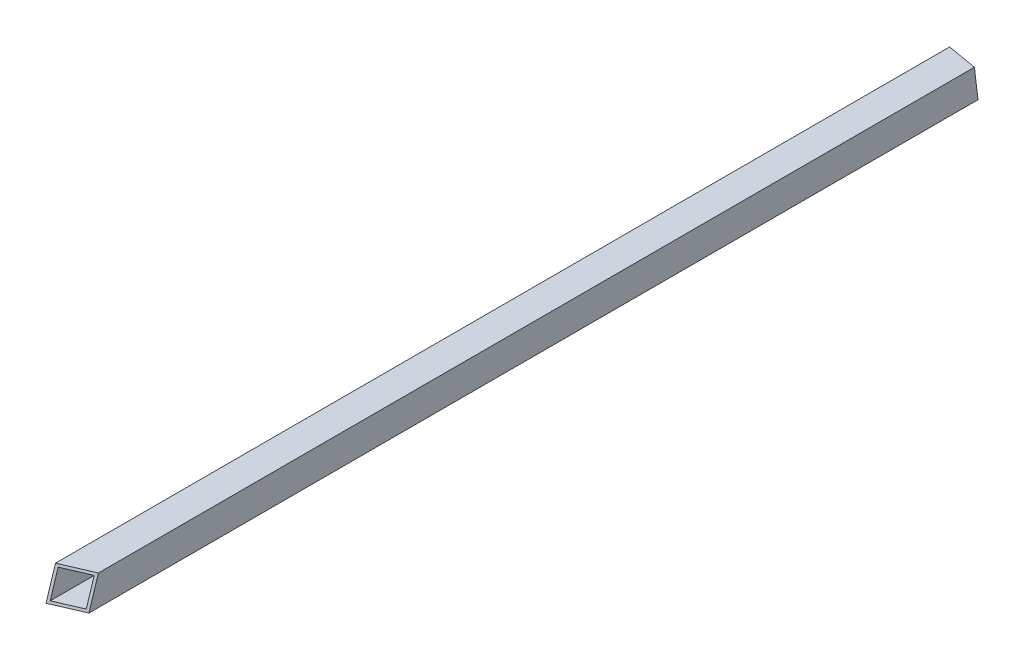
ISO-10303-21;
HEADER;
FILE_DESCRIPTION(('STEP AP214'),'2;1');
FILE_NAME('part.step','',(''),(''),'','','');
FILE_SCHEMA(('AUTOMOTIVE_DESIGN { 1 0 10303 214 1 1 1 1 }'));
ENDSEC;
DATA;
#1=APPLICATION_CONTEXT('core data for automotive mechanical design processes');
#2=APPLICATION_PROTOCOL_DEFINITION('international standard','automotive_design',2000,#1);
#3=PRODUCT_CONTEXT('',#1,'mechanical');
#4=PRODUCT('Part','Part','',(#3));
#5=PRODUCT_RELATED_PRODUCT_CATEGORY('part','',(#4));
#6=PRODUCT_DEFINITION_FORMATION('','',#4);
#7=PRODUCT_DEFINITION_CONTEXT('part definition',#1,'design');
#8=PRODUCT_DEFINITION('design','',#6,#7);
#9=PRODUCT_DEFINITION_SHAPE('','',#8);
#10=(LENGTH_UNIT() NAMED_UNIT(*) SI_UNIT(.MILLI.,.METRE.));
#11=(NAMED_UNIT(*) PLANE_ANGLE_UNIT() SI_UNIT($,.RADIAN.));
#12=(NAMED_UNIT(*) SI_UNIT($,.STERADIAN.) SOLID_ANGLE_UNIT());
#13=UNCERTAINTY_MEASURE_WITH_UNIT(LENGTH_MEASURE(1.E-05),#10,'distance_accuracy_value','');
#14=(GEOMETRIC_REPRESENTATION_CONTEXT(3) GLOBAL_UNCERTAINTY_ASSIGNED_CONTEXT((#13)) GLOBAL_UNIT_ASSIGNED_CONTEXT((#10,
#11,#12)) REPRESENTATION_CONTEXT('',''));
#15=CARTESIAN_POINT('',(0.,0.,0.));
#16=DIRECTION('',(0.,0.,1.));
#17=DIRECTION('',(1.,0.,0.));
#18=AXIS2_PLACEMENT_3D('',#15,#16,#17);
#19=CARTESIAN_POINT('',(70.0000000000001,-89.9999999999998,-1085.));
#20=DIRECTION('',(0.,1.,0.));
#21=DIRECTION('',(0.,0.,1.));
#22=AXIS2_PLACEMENT_3D('',#19,#20,#21);
#23=PLANE('',#22);
#24=DIRECTION('',(-0.985558600813723,0.,-0.169334711037329));
#25=VECTOR('',#24,1.);
#26=CARTESIAN_POINT('',(169.211852683729,-89.9999999999999,-1662.43090070623));
#27=LINE('',#26,#25);
#28=CARTESIAN_POINT('',(70.0000000000001,-89.9999999999999,-1679.47708181794));
#29=VERTEX_POINT('',#28);
#30=CARTESIAN_POINT('',(50.,-89.9999999999999,-1682.91340130006));
#31=VERTEX_POINT('',#30);
#32=EDGE_CURVE('E118',#29,#31,#27,.T.);
#33=ORIENTED_EDGE('',*,*,#32,.F.);
#34=DIRECTION('',(0.,0.,-1.));
#35=VECTOR('',#34,1.);
#36=CARTESIAN_POINT('',(70.0000000000001,-89.9999999999998,-1085.));
#37=LINE('',#36,#35);
#38=CARTESIAN_POINT('',(70.0000000000001,-89.9999999999998,-1086.16451850116));
#39=VERTEX_POINT('',#38);
#40=EDGE_CURVE('E55',#39,#29,#37,.T.);
#41=ORIENTED_EDGE('',*,*,#40,.F.);
#42=DIRECTION('',(0.917660497954147,0.,-0.397365336302183));
#43=VECTOR('',#42,1.);
#44=CARTESIAN_POINT('',(69.5753624365291,-89.9999999999998,-1085.98064194922));
#45=LINE('',#44,#43);
#46=CARTESIAN_POINT('',(50.,-89.9999999999999,-1077.50411877407));
#47=VERTEX_POINT('',#46);
#48=EDGE_CURVE('E130',#47,#39,#45,.T.);
#49=ORIENTED_EDGE('',*,*,#48,.F.);
#50=DIRECTION('',(0.,0.,-1.));
#51=VECTOR('',#50,1.);
#52=CARTESIAN_POINT('',(50.,-89.9999999999998,-1085.));
#53=LINE('',#52,#51);
#54=EDGE_CURVE('E137',#47,#31,#53,.T.);
#55=ORIENTED_EDGE('',*,*,#54,.T.);
#56=EDGE_LOOP('',(#33,#41,#49,#55));
#57=FACE_BOUND('',#56,.T.);
#58=ADVANCED_FACE('F41',(#57),#23,.F.);
#59=CARTESIAN_POINT('',(70.0000000000001,-89.9999999999998,-1085.));
#60=DIRECTION('',(-1.,0.,0.));
#61=DIRECTION('',(0.,0.,1.));
#62=AXIS2_PLACEMENT_3D('',#59,#60,#61);
#63=PLANE('',#62);
#64=DIRECTION('',(0.,-0.992932622114171,-0.118679433523578));
#65=VECTOR('',#64,1.);
#66=CARTESIAN_POINT('',(70.0000000000001,-19.9464157685872,-1671.10398629492));
#67=LINE('',#66,#65);
#68=CARTESIAN_POINT('',(70.0000000000001,-69.9999999999998,-1677.08659869994));
#69=VERTEX_POINT('',#68);
#70=EDGE_CURVE('E160',#69,#29,#67,.T.);
#71=ORIENTED_EDGE('',*,*,#70,.F.);
#72=DIRECTION('',(0.,0.,-1.));
#73=VECTOR('',#72,1.);
#74=CARTESIAN_POINT('',(70.0000000000001,-69.9999999999998,-1085.));
#75=LINE('',#74,#73);
#76=CARTESIAN_POINT('',(70.,-69.9999999999998,-1092.49588122593));
#77=VERTEX_POINT('',#76);
#78=EDGE_CURVE('E127',#77,#69,#75,.T.);
#79=ORIENTED_EDGE('',*,*,#78,.F.);
#80=DIRECTION('',(0.,0.953369256848501,-0.301806328787413));
#81=VECTOR('',#80,1.);
#82=CARTESIAN_POINT('',(70.0000000000001,-90.335070256782,-1086.05844593446));
#83=LINE('',#82,#81);
#84=EDGE_CURVE('E175',#39,#77,#83,.T.);
#85=ORIENTED_EDGE('',*,*,#84,.F.);
#86=ORIENTED_EDGE('',*,*,#40,.T.);
#87=EDGE_LOOP('',(#71,#79,#85,#86));
#88=FACE_BOUND('',#87,.T.);
#89=ADVANCED_FACE('F183',(#88),#63,.F.);
#90=CARTESIAN_POINT('',(70.0000000000001,-69.9999999999998,-1085.));
#91=DIRECTION('',(0.,-1.,0.));
#92=DIRECTION('',(0.,0.,-1.));
#93=AXIS2_PLACEMENT_3D('',#90,#91,#92);
#94=PLANE('',#93);
#95=DIRECTION('',(0.985558600813723,0.,0.169334711037329));
#96=VECTOR('',#95,1.);
#97=CARTESIAN_POINT('',(168.812906675213,-69.9999999999998,-1660.1089628853));
#98=LINE('',#97,#96);
#99=CARTESIAN_POINT('',(50.0000000000001,-69.9999999999998,-1680.52291818206));
#100=VERTEX_POINT('',#99);
#101=EDGE_CURVE('E163',#100,#69,#98,.T.);
#102=ORIENTED_EDGE('',*,*,#101,.F.);
#103=DIRECTION('',(0.,0.,-1.));
#104=VECTOR('',#103,1.);
#105=CARTESIAN_POINT('',(50.,-69.9999999999998,-1085.));
#106=LINE('',#105,#104);
#107=CARTESIAN_POINT('',(50.,-69.9999999999998,-1083.83548149884));
#108=VERTEX_POINT('',#107);
#109=EDGE_CURVE('E139',#108,#100,#106,.T.);
#110=ORIENTED_EDGE('',*,*,#109,.F.);
#111=DIRECTION('',(-0.917660497954147,0.,0.397365336302183));
#112=VECTOR('',#111,1.);
#113=CARTESIAN_POINT('',(67.2666533535802,-69.9999999999998,-1091.31228749839));
#114=LINE('',#113,#112);
#115=EDGE_CURVE('E173',#77,#108,#114,.T.);
#116=ORIENTED_EDGE('',*,*,#115,.F.);
#117=ORIENTED_EDGE('',*,*,#78,.T.);
#118=EDGE_LOOP('',(#102,#110,#116,#117));
#119=FACE_BOUND('',#118,.T.);
#120=ADVANCED_FACE('F185',(#119),#94,.F.);
#121=CARTESIAN_POINT('',(50.,-89.9999999999998,-1085.));
#122=DIRECTION('',(1.,0.,0.));
#123=DIRECTION('',(0.,0.,-1.));
#124=AXIS2_PLACEMENT_3D('',#121,#122,#123);
#125=PLANE('',#124);
#126=DIRECTION('',(0.,0.992932622114171,0.118679433523578));
#127=VECTOR('',#126,1.);
#128=CARTESIAN_POINT('',(50.,-19.5414775402697,-1674.49190587711));
#129=LINE('',#128,#127);
#130=EDGE_CURVE('E152',#31,#100,#129,.T.);
#131=ORIENTED_EDGE('',*,*,#130,.F.);
#132=ORIENTED_EDGE('',*,*,#54,.F.);
#133=DIRECTION('',(0.,-0.953369256848501,0.301806328787413));
#134=VECTOR('',#133,1.);
#135=CARTESIAN_POINT('',(50.,-87.8431885412949,-1078.18689655777));
#136=LINE('',#135,#134);
#137=EDGE_CURVE('E170',#108,#47,#136,.T.);
#138=ORIENTED_EDGE('',*,*,#137,.F.);
#139=ORIENTED_EDGE('',*,*,#109,.T.);
#140=EDGE_LOOP('',(#131,#132,#138,#139));
#141=FACE_BOUND('',#140,.T.);
#142=ADVANCED_FACE('F187',(#141),#125,.F.);
#143=CARTESIAN_POINT('',(60.,-79.9999999999999,-1085.));
#144=DIRECTION('',(0.381589956920139,0.278969159106108,0.881229432693505));
#145=DIRECTION('',(0.917660497954147,0.,-0.397365336302183));
#146=AXIS2_PLACEMENT_3D('',#143,#144,#145);
#147=PLANE('',#146);
#148=DIRECTION('',(0.,-0.953369256848501,0.301806328787413));
#149=VECTOR('',#148,1.);
#150=CARTESIAN_POINT('',(51.6000000000001,-86.5882783746876,-1079.27699310853));
#151=LINE('',#150,#149);
#152=CARTESIAN_POINT('',(51.6000000000001,-71.5999999999998,-1084.02180445902));
#153=VERTEX_POINT('',#152);
#154=CARTESIAN_POINT('',(51.6000000000001,-88.3999999999998,-1078.70345977022));
#155=VERTEX_POINT('',#154);
#156=EDGE_CURVE('E123',#153,#155,#151,.T.);
#157=ORIENTED_EDGE('',*,*,#156,.F.);
#158=DIRECTION('',(-0.917660497954147,0.,0.397365336302183));
#159=VECTOR('',#158,1.);
#160=CARTESIAN_POINT('',(66.1039888170073,-71.5999999999998,-1090.30232149865));
#161=LINE('',#160,#159);
#162=CARTESIAN_POINT('',(68.4000000000001,-71.5999999999997,-1091.29654022978));
#163=VERTEX_POINT('',#162);
#164=EDGE_CURVE('E149',#163,#153,#161,.T.);
#165=ORIENTED_EDGE('',*,*,#164,.F.);
#166=DIRECTION('',(0.,0.953369256848501,-0.301806328787413));
#167=VECTOR('',#166,1.);
#168=CARTESIAN_POINT('',(68.4000000000001,-88.6814590156968,-1085.88909458495));
#169=LINE('',#168,#167);
#170=CARTESIAN_POINT('',(68.4,-88.3999999999998,-1085.97819554098));
#171=VERTEX_POINT('',#170);
#172=EDGE_CURVE('E147',#171,#163,#169,.T.);
#173=ORIENTED_EDGE('',*,*,#172,.F.);
#174=DIRECTION('',(0.917660497954147,0.,-0.397365336302183));
#175=VECTOR('',#174,1.);
#176=CARTESIAN_POINT('',(68.0433044466845,-88.3999999999998,-1085.82373923735));
#177=LINE('',#176,#175);
#178=EDGE_CURVE('E48',#155,#171,#177,.T.);
#179=ORIENTED_EDGE('',*,*,#178,.F.);
#180=EDGE_LOOP('',(#157,#165,#173,#179));
#181=FACE_BOUND('',#180,.T.);
#182=ORIENTED_EDGE('',*,*,#137,.T.);
#183=ORIENTED_EDGE('',*,*,#48,.T.);
#184=ORIENTED_EDGE('',*,*,#84,.T.);
#185=ORIENTED_EDGE('',*,*,#115,.T.);
#186=EDGE_LOOP('',(#182,#183,#184,#185));
#187=FACE_BOUND('',#186,.T.);
#188=ADVANCED_FACE('F144',(#181,#187),#147,.T.);
#189=CARTESIAN_POINT('',(51.6000000000001,-88.3999999999998,-1085.));
#190=DIRECTION('',(1.,0.,0.));
#191=DIRECTION('',(0.,0.,-1.));
#192=AXIS2_PLACEMENT_3D('',#189,#190,#191);
#193=PLANE('',#192);
#194=DIRECTION('',(0.,0.,-1.));
#195=VECTOR('',#194,1.);
#196=CARTESIAN_POINT('',(51.6000000000001,-88.3999999999998,-1085.));
#197=LINE('',#196,#195);
#198=CARTESIAN_POINT('',(51.6000000000001,-88.4,-1682.44725709205));
#199=VERTEX_POINT('',#198);
#200=EDGE_CURVE('E114',#155,#199,#197,.T.);
#201=ORIENTED_EDGE('',*,*,#200,.T.);
#202=DIRECTION('',(0.,0.992932622114171,0.118679433523578));
#203=VECTOR('',#202,1.);
#204=CARTESIAN_POINT('',(51.6000000000001,-17.9964082912415,-1674.03232722074));
#205=LINE('',#204,#203);
#206=CARTESIAN_POINT('',(51.6000000000001,-71.5999999999999,-1680.43925127293));
#207=VERTEX_POINT('',#206);
#208=EDGE_CURVE('E11',#199,#207,#205,.T.);
#209=ORIENTED_EDGE('',*,*,#208,.T.);
#210=DIRECTION('',(0.,0.,-1.));
#211=VECTOR('',#210,1.);
#212=CARTESIAN_POINT('',(51.6000000000001,-71.5999999999998,-1085.));
#213=LINE('',#212,#211);
#214=EDGE_CURVE('E135',#153,#207,#213,.T.);
#215=ORIENTED_EDGE('',*,*,#214,.F.);
#216=ORIENTED_EDGE('',*,*,#156,.T.);
#217=EDGE_LOOP('',(#201,#209,#215,#216));
#218=FACE_BOUND('',#217,.T.);
#219=ADVANCED_FACE('F122',(#218),#193,.T.);
#220=CARTESIAN_POINT('',(68.4000000000001,-71.5999999999998,-1085.));
#221=DIRECTION('',(0.,-1.,0.));
#222=DIRECTION('',(0.,0.,-1.));
#223=AXIS2_PLACEMENT_3D('',#220,#221,#222);
#224=PLANE('',#223);
#225=ORIENTED_EDGE('',*,*,#214,.T.);
#226=DIRECTION('',(0.985558600813723,0.,0.169334711037329));
#227=VECTOR('',#226,1.);
#228=CARTESIAN_POINT('',(167.290701146874,-71.5999999999999,-1660.56174076038));
#229=LINE('',#228,#227);
#230=CARTESIAN_POINT('',(68.4000000000001,-71.5999999999999,-1677.55274290795));
#231=VERTEX_POINT('',#230);
#232=EDGE_CURVE('E63',#207,#231,#229,.T.);
#233=ORIENTED_EDGE('',*,*,#232,.T.);
#234=DIRECTION('',(0.,0.,-1.));
#235=VECTOR('',#234,1.);
#236=CARTESIAN_POINT('',(68.4000000000001,-71.5999999999998,-1085.));
#237=LINE('',#236,#235);
#238=EDGE_CURVE('E125',#163,#231,#237,.T.);
#239=ORIENTED_EDGE('',*,*,#238,.F.);
#240=ORIENTED_EDGE('',*,*,#164,.T.);
#241=EDGE_LOOP('',(#225,#233,#239,#240));
#242=FACE_BOUND('',#241,.T.);
#243=ADVANCED_FACE('F226',(#242),#224,.T.);
#244=CARTESIAN_POINT('',(68.4000000000001,-88.3999999999998,-1085.));
#245=DIRECTION('',(-1.,0.,0.));
#246=DIRECTION('',(0.,0.,1.));
#247=AXIS2_PLACEMENT_3D('',#244,#245,#246);
#248=PLANE('',#247);
#249=ORIENTED_EDGE('',*,*,#238,.T.);
#250=DIRECTION('',(0.,-0.992932622114171,-0.118679433523578));
#251=VECTOR('',#250,1.);
#252=CARTESIAN_POINT('',(68.4000000000001,-18.3365564030281,-1671.18647477171));
#253=LINE('',#252,#251);
#254=CARTESIAN_POINT('',(68.4000000000001,-88.4,-1679.56074872707));
#255=VERTEX_POINT('',#254);
#256=EDGE_CURVE('E119',#231,#255,#253,.T.);
#257=ORIENTED_EDGE('',*,*,#256,.T.);
#258=DIRECTION('',(0.,0.,-1.));
#259=VECTOR('',#258,1.);
#260=CARTESIAN_POINT('',(68.4000000000001,-88.3999999999998,-1085.));
#261=LINE('',#260,#259);
#262=EDGE_CURVE('E116',#171,#255,#261,.T.);
#263=ORIENTED_EDGE('',*,*,#262,.F.);
#264=ORIENTED_EDGE('',*,*,#172,.T.);
#265=EDGE_LOOP('',(#249,#257,#263,#264));
#266=FACE_BOUND('',#265,.T.);
#267=ADVANCED_FACE('F154',(#266),#248,.T.);
#268=CARTESIAN_POINT('',(68.4000000000001,-88.3999999999998,-1085.));
#269=DIRECTION('',(0.,1.,0.));
#270=DIRECTION('',(-1.,0.,0.));
#271=AXIS2_PLACEMENT_3D('',#268,#269,#270);
#272=PLANE('',#271);
#273=ORIENTED_EDGE('',*,*,#262,.T.);
#274=DIRECTION('',(-0.985558600813723,0.,-0.169334711037329));
#275=VECTOR('',#274,1.);
#276=CARTESIAN_POINT('',(167.625815794027,-88.3999999999997,-1662.51216852996));
#277=LINE('',#276,#275);
#278=EDGE_CURVE('E105',#255,#199,#277,.T.);
#279=ORIENTED_EDGE('',*,*,#278,.T.);
#280=ORIENTED_EDGE('',*,*,#200,.F.);
#281=ORIENTED_EDGE('',*,*,#178,.T.);
#282=EDGE_LOOP('',(#273,#279,#280,#281));
#283=FACE_BOUND('',#282,.T.);
#284=ADVANCED_FACE('F112',(#283),#272,.T.);
#285=CARTESIAN_POINT('',(60.,-80.,-1680.));
#286=DIRECTION('',(0.168171921974834,0.116989163112928,-0.978790958465303));
#287=DIRECTION('',(-0.985558600813723,0.,-0.169334711037329));
#288=AXIS2_PLACEMENT_3D('',#285,#286,#287);
#289=PLANE('',#288);
#290=ORIENTED_EDGE('',*,*,#278,.F.);
#291=ORIENTED_EDGE('',*,*,#256,.F.);
#292=ORIENTED_EDGE('',*,*,#232,.F.);
#293=ORIENTED_EDGE('',*,*,#208,.F.);
#294=EDGE_LOOP('',(#290,#291,#292,#293));
#295=FACE_BOUND('',#294,.T.);
#296=ORIENTED_EDGE('',*,*,#32,.T.);
#297=ORIENTED_EDGE('',*,*,#130,.T.);
#298=ORIENTED_EDGE('',*,*,#101,.T.);
#299=ORIENTED_EDGE('',*,*,#70,.T.);
#300=EDGE_LOOP('',(#296,#297,#298,#299));
#301=FACE_BOUND('',#300,.T.);
#302=ADVANCED_FACE('F103',(#295,#301),#289,.T.);
#303=CLOSED_SHELL('',(#58,#89,#120,#142,#188,#219,#243,#267,#284,#302));
#304=MANIFOLD_SOLID_BREP('B2',#303);
#305=ADVANCED_BREP_SHAPE_REPRESENTATION('',(#18,#304),#14);
#306=SHAPE_DEFINITION_REPRESENTATION(#9,#305);
ENDSEC;
END-ISO-10303-21;
